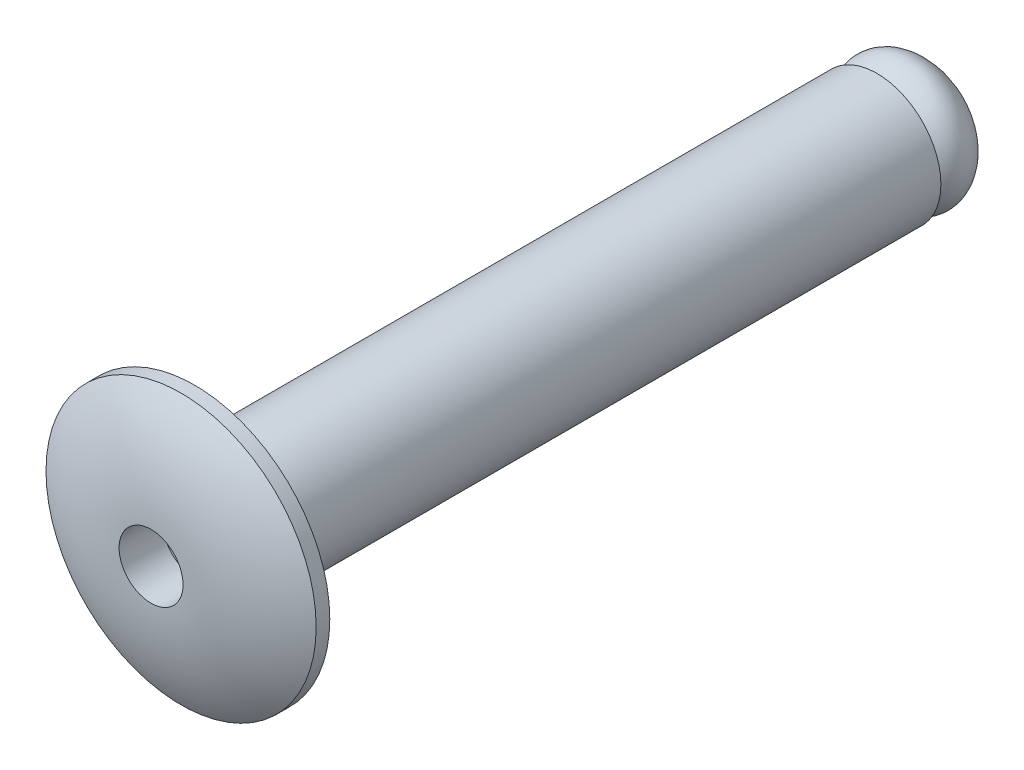
ISO-10303-21;
HEADER;
FILE_DESCRIPTION(('STEP AP214'),'2;1');
FILE_NAME('part.step','',(''),(''),'','','');
FILE_SCHEMA(('AUTOMOTIVE_DESIGN { 1 0 10303 214 1 1 1 1 }'));
ENDSEC;
DATA;
#1=APPLICATION_CONTEXT('core data for automotive mechanical design processes');
#2=APPLICATION_PROTOCOL_DEFINITION('international standard','automotive_design',2000,#1);
#3=PRODUCT_CONTEXT('',#1,'mechanical');
#4=PRODUCT('Part','Part','',(#3));
#5=PRODUCT_RELATED_PRODUCT_CATEGORY('part','',(#4));
#6=PRODUCT_DEFINITION_FORMATION('','',#4);
#7=PRODUCT_DEFINITION_CONTEXT('part definition',#1,'design');
#8=PRODUCT_DEFINITION('design','',#6,#7);
#9=PRODUCT_DEFINITION_SHAPE('','',#8);
#10=(LENGTH_UNIT() NAMED_UNIT(*) SI_UNIT(.MILLI.,.METRE.));
#11=(NAMED_UNIT(*) PLANE_ANGLE_UNIT() SI_UNIT($,.RADIAN.));
#12=(NAMED_UNIT(*) SI_UNIT($,.STERADIAN.) SOLID_ANGLE_UNIT());
#13=UNCERTAINTY_MEASURE_WITH_UNIT(LENGTH_MEASURE(1.E-05),#10,'distance_accuracy_value','');
#14=(GEOMETRIC_REPRESENTATION_CONTEXT(3) GLOBAL_UNCERTAINTY_ASSIGNED_CONTEXT((#13)) GLOBAL_UNIT_ASSIGNED_CONTEXT((#10,
#11,#12)) REPRESENTATION_CONTEXT('',''));
#15=CARTESIAN_POINT('',(0.,0.,0.));
#16=DIRECTION('',(0.,0.,1.));
#17=DIRECTION('',(1.,0.,0.));
#18=AXIS2_PLACEMENT_3D('',#15,#16,#17);
#19=CARTESIAN_POINT('',(0.,0.,-13.1853777770889));
#20=DIRECTION('',(1.,0.,0.));
#21=DIRECTION('',(0.,1.,0.));
#22=AXIS2_PLACEMENT_3D('',#19,#20,#21);
#23=ELLIPSE('',#22,1.190625,0.733822222911134);
#24=TRIMMED_CURVE('',#23,(PARAMETER_VALUE(4.71238898038469)),
(PARAMETER_VALUE(7.85398163397448)),.T.,.PARAMETER.);
#25=CARTESIAN_POINT('',(0.,0.,19.8628));
#26=DIRECTION('',(0.,0.,1.));
#27=AXIS1_PLACEMENT('',#25,#26);
#28=SURFACE_OF_REVOLUTION('',#24,#27);
#29=CARTESIAN_POINT('',(0.,0.,-12.7));
#30=DIRECTION('',(0.,0.,1.));
#31=DIRECTION('',(1.,0.,0.));
#32=AXIS2_PLACEMENT_3D('',#29,#30,#31);
#33=CIRCLE('',#32,0.89296875);
#34=CARTESIAN_POINT('',(0.89296875,0.,-12.7));
#35=VERTEX_POINT('',#34);
#36=EDGE_CURVE('E79',#35,#35,#33,.T.);
#37=ORIENTED_EDGE('',*,*,#36,.F.);
#38=EDGE_LOOP('',(#37));
#39=FACE_BOUND('',#38,.T.);
#40=CARTESIAN_POINT('',(0.,0.,-13.9192));
#41=VERTEX_POINT('',#40);
#42=VERTEX_LOOP('',#41);
#43=FACE_BOUND('',#42,.T.);
#44=ADVANCED_FACE('F39',(#39,#43),#28,.T.);
#45=CARTESIAN_POINT('',(0.,1.190625,-12.7));
#46=DIRECTION('',(0.,0.,1.));
#47=DIRECTION('',(1.,0.,0.));
#48=AXIS2_PLACEMENT_3D('',#45,#46,#47);
#49=PLANE('',#48);
#50=CARTESIAN_POINT('',(0.,0.,-12.7));
#51=DIRECTION('',(0.,0.,1.));
#52=DIRECTION('',(1.,0.,0.));
#53=AXIS2_PLACEMENT_3D('',#50,#51,#52);
#54=CIRCLE('',#53,1.190625);
#55=CARTESIAN_POINT('',(1.190625,0.,-12.7));
#56=VERTEX_POINT('',#55);
#57=EDGE_CURVE('E75',#56,#56,#54,.T.);
#58=ORIENTED_EDGE('',*,*,#57,.F.);
#59=EDGE_LOOP('',(#58));
#60=FACE_BOUND('',#59,.T.);
#61=ORIENTED_EDGE('',*,*,#36,.T.);
#62=EDGE_LOOP('',(#61));
#63=FACE_BOUND('',#62,.T.);
#64=ADVANCED_FACE('F51',(#60,#63),#49,.F.);
#65=CARTESIAN_POINT('',(0.,0.,19.8628));
#66=DIRECTION('',(0.,0.,1.));
#67=DIRECTION('',(1.,0.,0.));
#68=AXIS2_PLACEMENT_3D('',#65,#66,#67);
#69=CYLINDRICAL_SURFACE('',#68,1.190625);
#70=CARTESIAN_POINT('',(0.,0.,-0.254000000000001));
#71=DIRECTION('',(0.,0.,1.));
#72=DIRECTION('',(1.,0.,0.));
#73=AXIS2_PLACEMENT_3D('',#70,#71,#72);
#74=CIRCLE('',#73,1.190625);
#75=CARTESIAN_POINT('',(1.190625,0.,-0.254000000000001));
#76=VERTEX_POINT('',#75);
#77=EDGE_CURVE('E11',#76,#76,#74,.F.);
#78=ORIENTED_EDGE('',*,*,#77,.T.);
#79=EDGE_LOOP('',(#78));
#80=FACE_BOUND('',#79,.T.);
#81=ORIENTED_EDGE('',*,*,#57,.T.);
#82=EDGE_LOOP('',(#81));
#83=FACE_BOUND('',#82,.T.);
#84=ADVANCED_FACE('F56',(#80,#83),#69,.T.);
#85=CARTESIAN_POINT('',(0.,1.190625,0.));
#86=DIRECTION('',(0.,0.,1.));
#87=DIRECTION('',(1.,0.,0.));
#88=AXIS2_PLACEMENT_3D('',#85,#86,#87);
#89=PLANE('',#88);
#90=CARTESIAN_POINT('',(0.,0.,0.));
#91=DIRECTION('',(0.,0.,1.));
#92=DIRECTION('',(1.,0.,0.));
#93=AXIS2_PLACEMENT_3D('',#90,#91,#92);
#94=CIRCLE('',#93,1.444625);
#95=CARTESIAN_POINT('',(1.444625,0.,0.));
#96=VERTEX_POINT('',#95);
#97=EDGE_CURVE('E47',#96,#96,#94,.T.);
#98=ORIENTED_EDGE('',*,*,#97,.T.);
#99=EDGE_LOOP('',(#98));
#100=FACE_BOUND('',#99,.T.);
#101=CARTESIAN_POINT('',(0.,0.,0.));
#102=DIRECTION('',(0.,0.,1.));
#103=DIRECTION('',(1.,0.,0.));
#104=AXIS2_PLACEMENT_3D('',#101,#102,#103);
#105=CIRCLE('',#104,2.5146);
#106=CARTESIAN_POINT('',(2.5146,0.,0.));
#107=VERTEX_POINT('',#106);
#108=EDGE_CURVE('E71',#107,#107,#105,.T.);
#109=ORIENTED_EDGE('',*,*,#108,.F.);
#110=EDGE_LOOP('',(#109));
#111=FACE_BOUND('',#110,.T.);
#112=ADVANCED_FACE('F86',(#100,#111),#89,.F.);
#113=CARTESIAN_POINT('',(0.,0.,19.8628));
#114=DIRECTION('',(0.,0.,1.));
#115=DIRECTION('',(1.,0.,0.));
#116=AXIS2_PLACEMENT_3D('',#113,#114,#115);
#117=CYLINDRICAL_SURFACE('',#116,2.5146);
#118=CARTESIAN_POINT('',(0.,0.,0.253999999999997));
#119=DIRECTION('',(0.,0.,1.));
#120=DIRECTION('',(1.,0.,0.));
#121=AXIS2_PLACEMENT_3D('',#118,#119,#120);
#122=CIRCLE('',#121,2.5146);
#123=CARTESIAN_POINT('',(2.5146,0.,0.253999999999997));
#124=VERTEX_POINT('',#123);
#125=EDGE_CURVE('E67',#124,#124,#122,.T.);
#126=ORIENTED_EDGE('',*,*,#125,.F.);
#127=EDGE_LOOP('',(#126));
#128=FACE_BOUND('',#127,.T.);
#129=ORIENTED_EDGE('',*,*,#108,.T.);
#130=EDGE_LOOP('',(#129));
#131=FACE_BOUND('',#130,.T.);
#132=ADVANCED_FACE('F100',(#128,#131),#117,.T.);
#133=CARTESIAN_POINT('',(0.,0.,-2.76264912997158));
#134=DIRECTION('',(0.,0.,1.));
#135=DIRECTION('',(1.,0.,0.));
#136=AXIS2_PLACEMENT_3D('',#133,#134,#135);
#137=DEGENERATE_TOROIDAL_SURFACE('',#136,0.5953125,3.57544912997158,.T.);
#138=CARTESIAN_POINT('',(0.,0.,0.8128));
#139=DIRECTION('',(0.,0.,-1.));
#140=DIRECTION('',(-1.,0.,0.));
#141=AXIS2_PLACEMENT_3D('',#138,#139,#140);
#142=CIRCLE('',#141,0.5953125);
#143=CARTESIAN_POINT('',(-0.5953125,0.,0.8128));
#144=VERTEX_POINT('',#143);
#145=EDGE_CURVE('E65',#144,#144,#142,.T.);
#146=ORIENTED_EDGE('',*,*,#145,.T.);
#147=EDGE_LOOP('',(#146));
#148=FACE_BOUND('',#147,.T.);
#149=ORIENTED_EDGE('',*,*,#125,.T.);
#150=EDGE_LOOP('',(#149));
#151=FACE_BOUND('',#150,.T.);
#152=ADVANCED_FACE('F91',(#148,#151),#137,.T.);
#153=CARTESIAN_POINT('',(0.,0.,-0.254000000000001));
#154=DIRECTION('',(0.,0.,1.));
#155=DIRECTION('',(1.,0.,0.));
#156=AXIS2_PLACEMENT_3D('',#153,#154,#155);
#157=TOROIDAL_SURFACE('',#156,1.444625,0.254);
#158=ORIENTED_EDGE('',*,*,#77,.F.);
#159=EDGE_LOOP('',(#158));
#160=FACE_BOUND('',#159,.T.);
#161=ORIENTED_EDGE('',*,*,#97,.F.);
#162=EDGE_LOOP('',(#161));
#163=FACE_BOUND('',#162,.T.);
#164=ADVANCED_FACE('F41',(#160,#163),#157,.F.);
#165=CARTESIAN_POINT('',(0.,0.,19.8628));
#166=DIRECTION('',(0.,0.,-1.));
#167=DIRECTION('',(-1.,0.,0.));
#168=AXIS2_PLACEMENT_3D('',#165,#166,#167);
#169=CYLINDRICAL_SURFACE('',#168,0.5953125);
#170=CARTESIAN_POINT('',(0.,0.,0.));
#171=DIRECTION('',(0.,0.,-1.));
#172=DIRECTION('',(-1.,0.,0.));
#173=AXIS2_PLACEMENT_3D('',#170,#171,#172);
#174=CIRCLE('',#173,0.5953125);
#175=CARTESIAN_POINT('',(-0.5953125,0.,0.));
#176=VERTEX_POINT('',#175);
#177=EDGE_CURVE('E123',#176,#176,#174,.T.);
#178=ORIENTED_EDGE('',*,*,#177,.T.);
#179=EDGE_LOOP('',(#178));
#180=FACE_BOUND('',#179,.T.);
#181=ORIENTED_EDGE('',*,*,#145,.F.);
#182=EDGE_LOOP('',(#181));
#183=FACE_BOUND('',#182,.T.);
#184=ADVANCED_FACE('F90',(#180,#183),#169,.F.);
#185=CARTESIAN_POINT('',(0.,0.,0.));
#186=DIRECTION('',(0.,0.,-1.));
#187=DIRECTION('',(-1.,0.,0.));
#188=AXIS2_PLACEMENT_3D('',#185,#186,#187);
#189=PLANE('',#188);
#190=ORIENTED_EDGE('',*,*,#177,.F.);
#191=EDGE_LOOP('',(#190));
#192=FACE_BOUND('',#191,.T.);
#193=ADVANCED_FACE('F97',(#192),#189,.F.);
#194=CLOSED_SHELL('',(#44,#64,#84,#112,#132,#152,#164,#184,#193));
#195=MANIFOLD_SOLID_BREP('B2',#194);
#196=ADVANCED_BREP_SHAPE_REPRESENTATION('',(#18,#195),#14);
#197=SHAPE_DEFINITION_REPRESENTATION(#9,#196);
ENDSEC;
END-ISO-10303-21;
